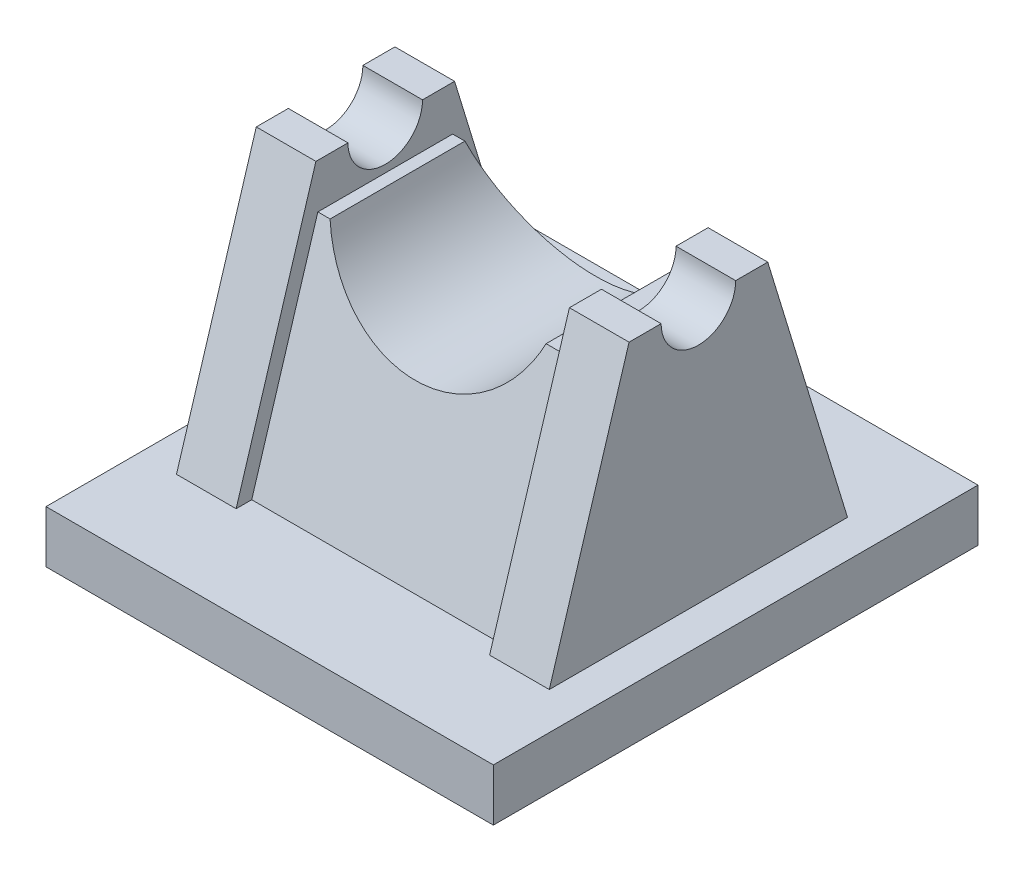
ISO-10303-21;
HEADER;
FILE_DESCRIPTION(('STEP AP214'),'2;1');
FILE_NAME('part.step','',(''),(''),'','','');
FILE_SCHEMA(('AUTOMOTIVE_DESIGN { 1 0 10303 214 1 1 1 1 }'));
ENDSEC;
DATA;
#1=APPLICATION_CONTEXT('core data for automotive mechanical design processes');
#2=APPLICATION_PROTOCOL_DEFINITION('international standard','automotive_design',2000,#1);
#3=PRODUCT_CONTEXT('',#1,'mechanical');
#4=PRODUCT('Part','Part','',(#3));
#5=PRODUCT_RELATED_PRODUCT_CATEGORY('part','',(#4));
#6=PRODUCT_DEFINITION_FORMATION('','',#4);
#7=PRODUCT_DEFINITION_CONTEXT('part definition',#1,'design');
#8=PRODUCT_DEFINITION('design','',#6,#7);
#9=PRODUCT_DEFINITION_SHAPE('','',#8);
#10=(LENGTH_UNIT() NAMED_UNIT(*) SI_UNIT(.MILLI.,.METRE.));
#11=(NAMED_UNIT(*) PLANE_ANGLE_UNIT() SI_UNIT($,.RADIAN.));
#12=(NAMED_UNIT(*) SI_UNIT($,.STERADIAN.) SOLID_ANGLE_UNIT());
#13=UNCERTAINTY_MEASURE_WITH_UNIT(LENGTH_MEASURE(1.E-05),#10,'distance_accuracy_value','');
#14=(GEOMETRIC_REPRESENTATION_CONTEXT(3) GLOBAL_UNCERTAINTY_ASSIGNED_CONTEXT((#13)) GLOBAL_UNIT_ASSIGNED_CONTEXT((#10,
#11,#12)) REPRESENTATION_CONTEXT('',''));
#15=CARTESIAN_POINT('',(0.,0.,0.));
#16=DIRECTION('',(0.,0.,1.));
#17=DIRECTION('',(1.,0.,0.));
#18=AXIS2_PLACEMENT_3D('',#15,#16,#17);
#19=CARTESIAN_POINT('',(-42.,29.,-10.9575732752756));
#20=DIRECTION('',(0.,-1.,0.));
#21=DIRECTION('',(0.,0.,-1.));
#22=AXIS2_PLACEMENT_3D('',#19,#20,#21);
#23=PLANE('',#22);
#24=DIRECTION('',(0.,0.,1.));
#25=VECTOR('',#24,1.);
#26=CARTESIAN_POINT('',(-40.360215297427,29.,-34.));
#27=LINE('',#26,#25);
#28=CARTESIAN_POINT('',(-40.360215297427,29.,-29.0424267247244));
#29=VERTEX_POINT('',#28);
#30=CARTESIAN_POINT('',(-40.360215297427,29.,-10.9575732752756));
#31=VERTEX_POINT('',#30);
#32=EDGE_CURVE('E56',#29,#31,#27,.T.);
#33=ORIENTED_EDGE('',*,*,#32,.F.);
#34=DIRECTION('',(1.,0.,0.));
#35=VECTOR('',#34,1.);
#36=CARTESIAN_POINT('',(-42.,29.,-29.0424267247244));
#37=LINE('',#36,#35);
#38=CARTESIAN_POINT('',(-42.,29.,-29.0424267247244));
#39=VERTEX_POINT('',#38);
#40=EDGE_CURVE('E292',#39,#29,#37,.T.);
#41=ORIENTED_EDGE('',*,*,#40,.F.);
#42=DIRECTION('',(0.,0.,-1.));
#43=VECTOR('',#42,1.);
#44=CARTESIAN_POINT('',(-42.,29.,-10.9575732752756));
#45=LINE('',#44,#43);
#46=CARTESIAN_POINT('',(-42.,29.,-10.9575732752756));
#47=VERTEX_POINT('',#46);
#48=EDGE_CURVE('E257',#47,#39,#45,.T.);
#49=ORIENTED_EDGE('',*,*,#48,.F.);
#50=DIRECTION('',(1.,0.,0.));
#51=VECTOR('',#50,1.);
#52=CARTESIAN_POINT('',(-42.,29.,-10.9575732752756));
#53=LINE('',#52,#51);
#54=EDGE_CURVE('E298',#47,#31,#53,.T.);
#55=ORIENTED_EDGE('',*,*,#54,.T.);
#56=EDGE_LOOP('',(#33,#41,#49,#55));
#57=FACE_BOUND('',#56,.T.);
#58=ADVANCED_FACE('F44',(#57),#23,.F.);
#59=CARTESIAN_POINT('',(-50.,0.,0.));
#60=DIRECTION('',(0.,0.292371704722741,0.956304755963034));
#61=DIRECTION('',(0.,-0.956304755963034,0.292371704722741));
#62=AXIS2_PLACEMENT_3D('',#59,#60,#61);
#63=PLANE('',#62);
#64=DIRECTION('',(1.,0.,0.));
#65=VECTOR('',#64,1.);
#66=CARTESIAN_POINT('',(-50.,35.,-10.7005738510533));
#67=LINE('',#66,#65);
#68=CARTESIAN_POINT('',(-8.,35.,-10.7005738510533));
#69=VERTEX_POINT('',#68);
#70=CARTESIAN_POINT('',(0.,35.,-10.7005738510533));
#71=VERTEX_POINT('',#70);
#72=EDGE_CURVE('E88',#69,#71,#67,.T.);
#73=ORIENTED_EDGE('',*,*,#72,.F.);
#74=DIRECTION('',(0.,-0.956304755963034,0.292371704722741));
#75=VECTOR('',#74,1.);
#76=CARTESIAN_POINT('',(-8.,35.,-10.7005738510533));
#77=LINE('',#76,#75);
#78=CARTESIAN_POINT('',(-8.,0.,0.));
#79=VERTEX_POINT('',#78);
#80=EDGE_CURVE('E243',#69,#79,#77,.T.);
#81=ORIENTED_EDGE('',*,*,#80,.T.);
#82=DIRECTION('',(1.,0.,0.));
#83=VECTOR('',#82,1.);
#84=CARTESIAN_POINT('',(-50.,0.,0.));
#85=LINE('',#84,#83);
#86=CARTESIAN_POINT('',(0.,0.,0.));
#87=VERTEX_POINT('',#86);
#88=EDGE_CURVE('E324',#79,#87,#85,.T.);
#89=ORIENTED_EDGE('',*,*,#88,.T.);
#90=DIRECTION('',(0.,-0.956304755963034,0.292371704722741));
#91=VECTOR('',#90,1.);
#92=CARTESIAN_POINT('',(0.,0.,0.));
#93=LINE('',#92,#91);
#94=EDGE_CURVE('E306',#71,#87,#93,.T.);
#95=ORIENTED_EDGE('',*,*,#94,.F.);
#96=EDGE_LOOP('',(#73,#81,#89,#95));
#97=FACE_BOUND('',#96,.T.);
#98=ADVANCED_FACE('F357',(#97),#63,.T.);
#99=CARTESIAN_POINT('',(-50.,35.,-10.7005738510533));
#100=DIRECTION('',(0.,1.,0.));
#101=DIRECTION('',(0.,0.,1.));
#102=AXIS2_PLACEMENT_3D('',#99,#100,#101);
#103=PLANE('',#102);
#104=DIRECTION('',(0.,0.,-1.));
#105=VECTOR('',#104,1.);
#106=CARTESIAN_POINT('',(-8.,35.,-12.269111485784));
#107=LINE('',#106,#105);
#108=CARTESIAN_POINT('',(-8.,35.,-15.));
#109=VERTEX_POINT('',#108);
#110=EDGE_CURVE('E287',#69,#109,#107,.T.);
#111=ORIENTED_EDGE('',*,*,#110,.F.);
#112=ORIENTED_EDGE('',*,*,#72,.T.);
#113=DIRECTION('',(0.,0.,1.));
#114=VECTOR('',#113,1.);
#115=CARTESIAN_POINT('',(0.,35.,-10.7005738510533));
#116=LINE('',#115,#114);
#117=CARTESIAN_POINT('',(0.,35.,-15.));
#118=VERTEX_POINT('',#117);
#119=EDGE_CURVE('E309',#118,#71,#116,.T.);
#120=ORIENTED_EDGE('',*,*,#119,.F.);
#121=DIRECTION('',(1.,0.,0.));
#122=VECTOR('',#121,1.);
#123=CARTESIAN_POINT('',(-50.,35.,-15.));
#124=LINE('',#123,#122);
#125=EDGE_CURVE('E341',#109,#118,#124,.T.);
#126=ORIENTED_EDGE('',*,*,#125,.F.);
#127=EDGE_LOOP('',(#111,#112,#120,#126));
#128=FACE_BOUND('',#127,.T.);
#129=ADVANCED_FACE('F364',(#128),#103,.T.);
#130=CARTESIAN_POINT('',(-50.,35.,-29.2994261489467));
#131=DIRECTION('',(0.,1.,0.));
#132=DIRECTION('',(0.,0.,1.));
#133=AXIS2_PLACEMENT_3D('',#130,#131,#132);
#134=PLANE('',#133);
#135=CARTESIAN_POINT('',(-8.,35.,-25.));
#136=VERTEX_POINT('',#135);
#137=CARTESIAN_POINT('',(-8.,35.,-29.2994261489467));
#138=VERTEX_POINT('',#137);
#139=EDGE_CURVE('E286',#136,#138,#107,.T.);
#140=ORIENTED_EDGE('',*,*,#139,.F.);
#141=DIRECTION('',(1.,0.,0.));
#142=VECTOR('',#141,1.);
#143=CARTESIAN_POINT('',(-50.,35.,-25.));
#144=LINE('',#143,#142);
#145=CARTESIAN_POINT('',(0.,35.,-25.));
#146=VERTEX_POINT('',#145);
#147=EDGE_CURVE('E349',#136,#146,#144,.T.);
#148=ORIENTED_EDGE('',*,*,#147,.T.);
#149=DIRECTION('',(0.,0.,1.));
#150=VECTOR('',#149,1.);
#151=CARTESIAN_POINT('',(0.,35.,-29.2994261489467));
#152=LINE('',#151,#150);
#153=CARTESIAN_POINT('',(0.,35.,-29.2994261489467));
#154=VERTEX_POINT('',#153);
#155=EDGE_CURVE('E332',#154,#146,#152,.T.);
#156=ORIENTED_EDGE('',*,*,#155,.F.);
#157=DIRECTION('',(1.,0.,0.));
#158=VECTOR('',#157,1.);
#159=CARTESIAN_POINT('',(-50.,35.,-29.2994261489467));
#160=LINE('',#159,#158);
#161=EDGE_CURVE('E348',#138,#154,#160,.T.);
#162=ORIENTED_EDGE('',*,*,#161,.F.);
#163=EDGE_LOOP('',(#140,#148,#156,#162));
#164=FACE_BOUND('',#163,.T.);
#165=ADVANCED_FACE('F374',(#164),#134,.T.);
#166=CARTESIAN_POINT('',(-50.,0.,-40.));
#167=DIRECTION('',(0.,0.292371704722741,-0.956304755963034));
#168=DIRECTION('',(0.,0.956304755963034,0.292371704722741));
#169=AXIS2_PLACEMENT_3D('',#166,#167,#168);
#170=PLANE('',#169);
#171=DIRECTION('',(1.,0.,0.));
#172=VECTOR('',#171,1.);
#173=CARTESIAN_POINT('',(-50.,0.,-40.));
#174=LINE('',#173,#172);
#175=CARTESIAN_POINT('',(-8.,0.,-40.));
#176=VERTEX_POINT('',#175);
#177=CARTESIAN_POINT('',(0.,0.,-40.));
#178=VERTEX_POINT('',#177);
#179=EDGE_CURVE('E352',#176,#178,#174,.T.);
#180=ORIENTED_EDGE('',*,*,#179,.F.);
#181=DIRECTION('',(0.,0.956304755963034,0.292371704722741));
#182=VECTOR('',#181,1.);
#183=CARTESIAN_POINT('',(-8.,0.,-40.));
#184=LINE('',#183,#182);
#185=EDGE_CURVE('E284',#176,#138,#184,.T.);
#186=ORIENTED_EDGE('',*,*,#185,.T.);
#187=ORIENTED_EDGE('',*,*,#161,.T.);
#188=DIRECTION('',(0.,0.956304755963034,0.292371704722741));
#189=VECTOR('',#188,1.);
#190=CARTESIAN_POINT('',(0.,0.,-40.));
#191=LINE('',#190,#189);
#192=EDGE_CURVE('E326',#178,#154,#191,.T.);
#193=ORIENTED_EDGE('',*,*,#192,.F.);
#194=EDGE_LOOP('',(#180,#186,#187,#193));
#195=FACE_BOUND('',#194,.T.);
#196=ADVANCED_FACE('F379',(#195),#170,.T.);
#197=CARTESIAN_POINT('',(-50.,35.,-20.));
#198=DIRECTION('',(1.,0.,0.));
#199=DIRECTION('',(0.,0.,-1.));
#200=AXIS2_PLACEMENT_3D('',#197,#198,#199);
#201=CYLINDRICAL_SURFACE('',#200,5.);
#202=CARTESIAN_POINT('',(-50.,35.,-15.));
#203=VERTEX_POINT('',#202);
#204=CARTESIAN_POINT('',(-42.,34.9999999999999,-15.));
#205=VERTEX_POINT('',#204);
#206=EDGE_CURVE('E342',#203,#205,#124,.T.);
#207=ORIENTED_EDGE('',*,*,#206,.T.);
#208=CARTESIAN_POINT('',(-42.,35.,-20.));
#209=DIRECTION('',(1.,0.,0.));
#210=DIRECTION('',(0.,0.,-1.));
#211=AXIS2_PLACEMENT_3D('',#208,#209,#210);
#212=CIRCLE('',#211,5.);
#213=CARTESIAN_POINT('',(-42.,34.9999999999997,-25.));
#214=VERTEX_POINT('',#213);
#215=EDGE_CURVE('E303',#205,#214,#212,.T.);
#216=ORIENTED_EDGE('',*,*,#215,.T.);
#217=CARTESIAN_POINT('',(-50.,35.,-25.));
#218=VERTEX_POINT('',#217);
#219=EDGE_CURVE('E343',#218,#214,#144,.T.);
#220=ORIENTED_EDGE('',*,*,#219,.F.);
#221=CARTESIAN_POINT('',(-50.,35.,-20.));
#222=DIRECTION('',(-1.,0.,0.));
#223=DIRECTION('',(0.,0.,-1.));
#224=AXIS2_PLACEMENT_3D('',#221,#222,#223);
#225=CIRCLE('',#224,5.);
#226=EDGE_CURVE('E320',#218,#203,#225,.T.);
#227=ORIENTED_EDGE('',*,*,#226,.T.);
#228=EDGE_LOOP('',(#207,#216,#220,#227));
#229=FACE_BOUND('',#228,.T.);
#230=ADVANCED_FACE('F416',(#229),#201,.F.);
#231=DIRECTION('',(0.,-0.956304755963034,0.292371704722741));
#232=VECTOR('',#231,1.);
#233=CARTESIAN_POINT('',(-42.,35.,-10.7005738510533));
#234=LINE('',#233,#232);
#235=CARTESIAN_POINT('',(-42.,35.,-10.7005738510533));
#236=VERTEX_POINT('',#235);
#237=CARTESIAN_POINT('',(-42.,0.,0.));
#238=VERTEX_POINT('',#237);
#239=EDGE_CURVE('E246',#236,#238,#234,.T.);
#240=ORIENTED_EDGE('',*,*,#239,.F.);
#241=CARTESIAN_POINT('',(-50.,35.,-10.7005738510533));
#242=VERTEX_POINT('',#241);
#243=EDGE_CURVE('E52',#242,#236,#67,.T.);
#244=ORIENTED_EDGE('',*,*,#243,.F.);
#245=DIRECTION('',(0.,-0.956304755963034,0.292371704722741));
#246=VECTOR('',#245,1.);
#247=CARTESIAN_POINT('',(-50.,0.,0.));
#248=LINE('',#247,#246);
#249=CARTESIAN_POINT('',(-50.,0.,0.));
#250=VERTEX_POINT('',#249);
#251=EDGE_CURVE('E310',#242,#250,#248,.T.);
#252=ORIENTED_EDGE('',*,*,#251,.T.);
#253=EDGE_CURVE('E354',#250,#238,#85,.T.);
#254=ORIENTED_EDGE('',*,*,#253,.T.);
#255=EDGE_LOOP('',(#240,#244,#252,#254));
#256=FACE_BOUND('',#255,.T.);
#257=ADVANCED_FACE('F50',(#256),#63,.T.);
#258=DIRECTION('',(0.,0.,1.));
#259=VECTOR('',#258,1.);
#260=CARTESIAN_POINT('',(-42.,35.,-12.269111485784));
#261=LINE('',#260,#259);
#262=EDGE_CURVE('E250',#205,#236,#261,.T.);
#263=ORIENTED_EDGE('',*,*,#262,.F.);
#264=ORIENTED_EDGE('',*,*,#206,.F.);
#265=DIRECTION('',(0.,0.,1.));
#266=VECTOR('',#265,1.);
#267=CARTESIAN_POINT('',(-50.,35.,-10.7005738510533));
#268=LINE('',#267,#266);
#269=EDGE_CURVE('E318',#203,#242,#268,.T.);
#270=ORIENTED_EDGE('',*,*,#269,.T.);
#271=ORIENTED_EDGE('',*,*,#243,.T.);
#272=EDGE_LOOP('',(#263,#264,#270,#271));
#273=FACE_BOUND('',#272,.T.);
#274=ADVANCED_FACE('F401',(#273),#103,.T.);
#275=CARTESIAN_POINT('',(-8.,35.,-20.));
#276=DIRECTION('',(1.,0.,0.));
#277=DIRECTION('',(0.,0.,-1.));
#278=AXIS2_PLACEMENT_3D('',#275,#276,#277);
#279=CIRCLE('',#278,5.);
#280=EDGE_CURVE('E293',#109,#136,#279,.T.);
#281=ORIENTED_EDGE('',*,*,#280,.F.);
#282=ORIENTED_EDGE('',*,*,#125,.T.);
#283=CARTESIAN_POINT('',(0.,35.,-20.));
#284=DIRECTION('',(-1.,0.,0.));
#285=DIRECTION('',(0.,0.,-1.));
#286=AXIS2_PLACEMENT_3D('',#283,#284,#285);
#287=CIRCLE('',#286,5.);
#288=EDGE_CURVE('E335',#146,#118,#287,.T.);
#289=ORIENTED_EDGE('',*,*,#288,.F.);
#290=ORIENTED_EDGE('',*,*,#147,.F.);
#291=EDGE_LOOP('',(#281,#282,#289,#290));
#292=FACE_BOUND('',#291,.T.);
#293=ADVANCED_FACE('F370',(#292),#201,.F.);
#294=CARTESIAN_POINT('',(-42.,35.,-29.2994261489467));
#295=VERTEX_POINT('',#294);
#296=EDGE_CURVE('E242',#295,#214,#261,.T.);
#297=ORIENTED_EDGE('',*,*,#296,.F.);
#298=CARTESIAN_POINT('',(-50.,35.,-29.2994261489467));
#299=VERTEX_POINT('',#298);
#300=EDGE_CURVE('E96',#299,#295,#160,.T.);
#301=ORIENTED_EDGE('',*,*,#300,.F.);
#302=DIRECTION('',(0.,0.,1.));
#303=VECTOR('',#302,1.);
#304=CARTESIAN_POINT('',(-50.,35.,-29.2994261489467));
#305=LINE('',#304,#303);
#306=EDGE_CURVE('E314',#299,#218,#305,.T.);
#307=ORIENTED_EDGE('',*,*,#306,.T.);
#308=ORIENTED_EDGE('',*,*,#219,.T.);
#309=EDGE_LOOP('',(#297,#301,#307,#308));
#310=FACE_BOUND('',#309,.T.);
#311=ADVANCED_FACE('F411',(#310),#134,.T.);
#312=DIRECTION('',(0.,0.956304755963034,0.292371704722741));
#313=VECTOR('',#312,1.);
#314=CARTESIAN_POINT('',(-42.,0.,-40.));
#315=LINE('',#314,#313);
#316=CARTESIAN_POINT('',(-42.,0.,-40.));
#317=VERTEX_POINT('',#316);
#318=EDGE_CURVE('E263',#317,#295,#315,.T.);
#319=ORIENTED_EDGE('',*,*,#318,.F.);
#320=CARTESIAN_POINT('',(-50.,0.,-40.));
#321=VERTEX_POINT('',#320);
#322=EDGE_CURVE('E351',#321,#317,#174,.T.);
#323=ORIENTED_EDGE('',*,*,#322,.F.);
#324=DIRECTION('',(0.,0.956304755963034,0.292371704722741));
#325=VECTOR('',#324,1.);
#326=CARTESIAN_POINT('',(-50.,0.,-40.));
#327=LINE('',#326,#325);
#328=EDGE_CURVE('E315',#321,#299,#327,.T.);
#329=ORIENTED_EDGE('',*,*,#328,.T.);
#330=ORIENTED_EDGE('',*,*,#300,.T.);
#331=EDGE_LOOP('',(#319,#323,#329,#330));
#332=FACE_BOUND('',#331,.T.);
#333=ADVANCED_FACE('F414',(#332),#170,.T.);
#334=CARTESIAN_POINT('',(-50.,35.,-20.));
#335=DIRECTION('',(1.,0.,0.));
#336=DIRECTION('',(0.,0.,-1.));
#337=AXIS2_PLACEMENT_3D('',#334,#335,#336);
#338=PLANE('',#337);
#339=ORIENTED_EDGE('',*,*,#251,.F.);
#340=ORIENTED_EDGE('',*,*,#269,.F.);
#341=ORIENTED_EDGE('',*,*,#226,.F.);
#342=ORIENTED_EDGE('',*,*,#306,.F.);
#343=ORIENTED_EDGE('',*,*,#328,.F.);
#344=DIRECTION('',(0.,0.,-1.));
#345=VECTOR('',#344,1.);
#346=CARTESIAN_POINT('',(-50.,0.,-40.));
#347=LINE('',#346,#345);
#348=EDGE_CURVE('E307',#250,#321,#347,.T.);
#349=ORIENTED_EDGE('',*,*,#348,.F.);
#350=EDGE_LOOP('',(#339,#340,#341,#342,#343,#349));
#351=FACE_BOUND('',#350,.T.);
#352=ADVANCED_FACE('F410',(#351),#338,.F.);
#353=CARTESIAN_POINT('',(0.,35.,-20.));
#354=DIRECTION('',(1.,0.,0.));
#355=DIRECTION('',(0.,0.,-1.));
#356=AXIS2_PLACEMENT_3D('',#353,#354,#355);
#357=PLANE('',#356);
#358=ORIENTED_EDGE('',*,*,#94,.T.);
#359=DIRECTION('',(0.,0.,-1.));
#360=VECTOR('',#359,1.);
#361=CARTESIAN_POINT('',(0.,0.,-40.));
#362=LINE('',#361,#360);
#363=EDGE_CURVE('E327',#87,#178,#362,.T.);
#364=ORIENTED_EDGE('',*,*,#363,.T.);
#365=ORIENTED_EDGE('',*,*,#192,.T.);
#366=ORIENTED_EDGE('',*,*,#155,.T.);
#367=ORIENTED_EDGE('',*,*,#288,.T.);
#368=ORIENTED_EDGE('',*,*,#119,.T.);
#369=EDGE_LOOP('',(#358,#364,#365,#366,#367,#368));
#370=FACE_BOUND('',#369,.T.);
#371=ADVANCED_FACE('F363',(#370),#357,.T.);
#372=CARTESIAN_POINT('',(-42.,29.,-29.0424267247244));
#373=DIRECTION('',(0.,-0.292371704722741,0.956304755963034));
#374=DIRECTION('',(0.,-0.956304755963034,-0.292371704722741));
#375=AXIS2_PLACEMENT_3D('',#372,#373,#374);
#376=PLANE('',#375);
#377=ORIENTED_EDGE('',*,*,#40,.T.);
#378=CARTESIAN_POINT('',(-25.8745981630098,34.5151515151515,-27.3562756936494));
#379=DIRECTION('',(0.,-0.292371704722741,0.956304755963034));
#380=DIRECTION('',(0.,0.956304755963034,0.292371704722741));
#381=AXIS2_PLACEMENT_3D('',#378,#379,#380);
#382=ELLIPSE('',#381,16.2082222255508,15.5);
#383=CARTESIAN_POINT('',(-11.3889810285926,29.,-29.0424267247244));
#384=VERTEX_POINT('',#383);
#385=EDGE_CURVE('E237',#29,#384,#382,.T.);
#386=ORIENTED_EDGE('',*,*,#385,.T.);
#387=CARTESIAN_POINT('',(-8.,29.,-29.0424267247244));
#388=VERTEX_POINT('',#387);
#389=EDGE_CURVE('E294',#384,#388,#37,.T.);
#390=ORIENTED_EDGE('',*,*,#389,.T.);
#391=DIRECTION('',(0.,-0.956304755963034,-0.292371704722741));
#392=VECTOR('',#391,1.);
#393=CARTESIAN_POINT('',(-8.,29.,-29.0424267247244));
#394=LINE('',#393,#392);
#395=CARTESIAN_POINT('',(-8.,0.,-37.9086164870257));
#396=VERTEX_POINT('',#395);
#397=EDGE_CURVE('E279',#388,#396,#394,.T.);
#398=ORIENTED_EDGE('',*,*,#397,.T.);
#399=DIRECTION('',(1.,0.,0.));
#400=VECTOR('',#399,1.);
#401=CARTESIAN_POINT('',(-42.,0.,-37.9086164870257));
#402=LINE('',#401,#400);
#403=CARTESIAN_POINT('',(-42.,0.,-37.9086164870257));
#404=VERTEX_POINT('',#403);
#405=EDGE_CURVE('E288',#404,#396,#402,.T.);
#406=ORIENTED_EDGE('',*,*,#405,.F.);
#407=DIRECTION('',(0.,-0.956304755963034,-0.292371704722741));
#408=VECTOR('',#407,1.);
#409=CARTESIAN_POINT('',(-42.,29.,-29.0424267247244));
#410=LINE('',#409,#408);
#411=EDGE_CURVE('E256',#39,#404,#410,.T.);
#412=ORIENTED_EDGE('',*,*,#411,.F.);
#413=EDGE_LOOP('',(#377,#386,#390,#398,#406,#412));
#414=FACE_BOUND('',#413,.T.);
#415=ADVANCED_FACE('F387',(#414),#376,.F.);
#416=ORIENTED_EDGE('',*,*,#389,.F.);
#417=DIRECTION('',(0.,0.,1.));
#418=VECTOR('',#417,1.);
#419=CARTESIAN_POINT('',(-11.3889810285926,29.,-34.));
#420=LINE('',#419,#418);
#421=CARTESIAN_POINT('',(-11.3889810285926,29.,-10.9575732752756));
#422=VERTEX_POINT('',#421);
#423=EDGE_CURVE('E233',#384,#422,#420,.T.);
#424=ORIENTED_EDGE('',*,*,#423,.T.);
#425=CARTESIAN_POINT('',(-8.,29.,-10.9575732752756));
#426=VERTEX_POINT('',#425);
#427=EDGE_CURVE('E299',#422,#426,#53,.T.);
#428=ORIENTED_EDGE('',*,*,#427,.T.);
#429=DIRECTION('',(0.,0.,-1.));
#430=VECTOR('',#429,1.);
#431=CARTESIAN_POINT('',(-8.,29.,-10.9575732752756));
#432=LINE('',#431,#430);
#433=EDGE_CURVE('E273',#426,#388,#432,.T.);
#434=ORIENTED_EDGE('',*,*,#433,.T.);
#435=EDGE_LOOP('',(#416,#424,#428,#434));
#436=FACE_BOUND('',#435,.T.);
#437=ADVANCED_FACE('F388',(#436),#23,.F.);
#438=CARTESIAN_POINT('',(-42.,29.,-10.9575732752756));
#439=DIRECTION('',(0.,0.292371704722741,0.956304755963034));
#440=DIRECTION('',(0.,-0.956304755963034,0.292371704722741));
#441=AXIS2_PLACEMENT_3D('',#438,#439,#440);
#442=PLANE('',#441);
#443=CARTESIAN_POINT('',(-25.8745981630098,34.5151515151515,-12.6437243063506));
#444=DIRECTION('',(0.,0.292371704722741,0.956304755963034));
#445=DIRECTION('',(0.,-0.956304755963034,0.292371704722741));
#446=AXIS2_PLACEMENT_3D('',#443,#444,#445);
#447=ELLIPSE('',#446,16.2082222255508,15.5);
#448=EDGE_CURVE('E11',#31,#422,#447,.T.);
#449=ORIENTED_EDGE('',*,*,#448,.F.);
#450=ORIENTED_EDGE('',*,*,#54,.F.);
#451=DIRECTION('',(0.,-0.956304755963034,0.292371704722741));
#452=VECTOR('',#451,1.);
#453=CARTESIAN_POINT('',(-42.,29.,-10.9575732752756));
#454=LINE('',#453,#452);
#455=CARTESIAN_POINT('',(-42.,0.,-2.0913835129743));
#456=VERTEX_POINT('',#455);
#457=EDGE_CURVE('E254',#47,#456,#454,.T.);
#458=ORIENTED_EDGE('',*,*,#457,.T.);
#459=DIRECTION('',(1.,0.,0.));
#460=VECTOR('',#459,1.);
#461=CARTESIAN_POINT('',(-42.,0.,-2.0913835129743));
#462=LINE('',#461,#460);
#463=CARTESIAN_POINT('',(-8.,0.,-2.0913835129743));
#464=VERTEX_POINT('',#463);
#465=EDGE_CURVE('E267',#456,#464,#462,.T.);
#466=ORIENTED_EDGE('',*,*,#465,.T.);
#467=DIRECTION('',(0.,-0.956304755963034,0.292371704722741));
#468=VECTOR('',#467,1.);
#469=CARTESIAN_POINT('',(-8.,29.,-10.9575732752756));
#470=LINE('',#469,#468);
#471=EDGE_CURVE('E275',#426,#464,#470,.T.);
#472=ORIENTED_EDGE('',*,*,#471,.F.);
#473=ORIENTED_EDGE('',*,*,#427,.F.);
#474=EDGE_LOOP('',(#449,#450,#458,#466,#472,#473));
#475=FACE_BOUND('',#474,.T.);
#476=ADVANCED_FACE('F391',(#475),#442,.T.);
#477=CARTESIAN_POINT('',(-42.,0.,0.));
#478=DIRECTION('',(1.,0.,0.));
#479=DIRECTION('',(0.,0.,-1.));
#480=AXIS2_PLACEMENT_3D('',#477,#478,#479);
#481=PLANE('',#480);
#482=ORIENTED_EDGE('',*,*,#262,.T.);
#483=ORIENTED_EDGE('',*,*,#239,.T.);
#484=DIRECTION('',(0.,0.,-1.));
#485=VECTOR('',#484,1.);
#486=CARTESIAN_POINT('',(-42.,0.,0.));
#487=LINE('',#486,#485);
#488=EDGE_CURVE('E249',#238,#456,#487,.T.);
#489=ORIENTED_EDGE('',*,*,#488,.T.);
#490=ORIENTED_EDGE('',*,*,#457,.F.);
#491=ORIENTED_EDGE('',*,*,#48,.T.);
#492=ORIENTED_EDGE('',*,*,#411,.T.);
#493=DIRECTION('',(0.,0.,-1.));
#494=VECTOR('',#493,1.);
#495=CARTESIAN_POINT('',(-42.,0.,-37.9086164870257));
#496=LINE('',#495,#494);
#497=EDGE_CURVE('E265',#404,#317,#496,.T.);
#498=ORIENTED_EDGE('',*,*,#497,.T.);
#499=ORIENTED_EDGE('',*,*,#318,.T.);
#500=ORIENTED_EDGE('',*,*,#296,.T.);
#501=ORIENTED_EDGE('',*,*,#215,.F.);
#502=EDGE_LOOP('',(#482,#483,#489,#490,#491,#492,#498,#499,#500,#501));
#503=FACE_BOUND('',#502,.T.);
#504=ADVANCED_FACE('F398',(#503),#481,.T.);
#505=CARTESIAN_POINT('',(-8.,0.,0.));
#506=DIRECTION('',(1.,0.,0.));
#507=DIRECTION('',(0.,0.,-1.));
#508=AXIS2_PLACEMENT_3D('',#505,#506,#507);
#509=PLANE('',#508);
#510=ORIENTED_EDGE('',*,*,#280,.T.);
#511=ORIENTED_EDGE('',*,*,#139,.T.);
#512=ORIENTED_EDGE('',*,*,#185,.F.);
#513=DIRECTION('',(0.,0.,-1.));
#514=VECTOR('',#513,1.);
#515=CARTESIAN_POINT('',(-8.,0.,-37.9086164870257));
#516=LINE('',#515,#514);
#517=EDGE_CURVE('E282',#396,#176,#516,.T.);
#518=ORIENTED_EDGE('',*,*,#517,.F.);
#519=ORIENTED_EDGE('',*,*,#397,.F.);
#520=ORIENTED_EDGE('',*,*,#433,.F.);
#521=ORIENTED_EDGE('',*,*,#471,.T.);
#522=DIRECTION('',(0.,0.,-1.));
#523=VECTOR('',#522,1.);
#524=CARTESIAN_POINT('',(-8.,0.,0.));
#525=LINE('',#524,#523);
#526=EDGE_CURVE('E270',#79,#464,#525,.T.);
#527=ORIENTED_EDGE('',*,*,#526,.F.);
#528=ORIENTED_EDGE('',*,*,#80,.F.);
#529=ORIENTED_EDGE('',*,*,#110,.T.);
#530=EDGE_LOOP('',(#510,#511,#512,#518,#519,#520,#521,#527,#528,#529));
#531=FACE_BOUND('',#530,.T.);
#532=ADVANCED_FACE('F371',(#531),#509,.F.);
#533=CARTESIAN_POINT('',(-25.8745981630098,34.5151515151515,-34.));
#534=DIRECTION('',(0.,0.,1.));
#535=DIRECTION('',(1.,0.,0.));
#536=AXIS2_PLACEMENT_3D('',#533,#534,#535);
#537=CYLINDRICAL_SURFACE('',#536,15.5);
#538=ORIENTED_EDGE('',*,*,#32,.T.);
#539=ORIENTED_EDGE('',*,*,#448,.T.);
#540=ORIENTED_EDGE('',*,*,#423,.F.);
#541=ORIENTED_EDGE('',*,*,#385,.F.);
#542=EDGE_LOOP('',(#538,#539,#540,#541));
#543=FACE_BOUND('',#542,.T.);
#544=ADVANCED_FACE('F448',(#543),#537,.F.);
#545=CARTESIAN_POINT('',(5.,-7.,-52.5));
#546=DIRECTION('',(-1.,0.,0.));
#547=DIRECTION('',(0.,0.,1.));
#548=AXIS2_PLACEMENT_3D('',#545,#546,#547);
#549=PLANE('',#548);
#550=DIRECTION('',(0.,0.,1.));
#551=VECTOR('',#550,1.);
#552=CARTESIAN_POINT('',(5.,0.,-52.5));
#553=LINE('',#552,#551);
#554=CARTESIAN_POINT('',(5.,0.,-52.5));
#555=VERTEX_POINT('',#554);
#556=CARTESIAN_POINT('',(5.,0.,12.5));
#557=VERTEX_POINT('',#556);
#558=EDGE_CURVE('E229',#555,#557,#553,.T.);
#559=ORIENTED_EDGE('',*,*,#558,.T.);
#560=DIRECTION('',(0.,1.,0.));
#561=VECTOR('',#560,1.);
#562=CARTESIAN_POINT('',(5.,-7.,12.5));
#563=LINE('',#562,#561);
#564=CARTESIAN_POINT('',(5.,-7.,12.5));
#565=VERTEX_POINT('',#564);
#566=EDGE_CURVE('E208',#565,#557,#563,.T.);
#567=ORIENTED_EDGE('',*,*,#566,.F.);
#568=DIRECTION('',(0.,0.,1.));
#569=VECTOR('',#568,1.);
#570=CARTESIAN_POINT('',(5.,-7.,-52.5));
#571=LINE('',#570,#569);
#572=CARTESIAN_POINT('',(5.,-7.,-52.5));
#573=VERTEX_POINT('',#572);
#574=EDGE_CURVE('E220',#573,#565,#571,.T.);
#575=ORIENTED_EDGE('',*,*,#574,.F.);
#576=DIRECTION('',(0.,1.,0.));
#577=VECTOR('',#576,1.);
#578=CARTESIAN_POINT('',(5.,-7.,-52.5));
#579=LINE('',#578,#577);
#580=EDGE_CURVE('E642',#573,#555,#579,.T.);
#581=ORIENTED_EDGE('',*,*,#580,.T.);
#582=EDGE_LOOP('',(#559,#567,#575,#581));
#583=FACE_BOUND('',#582,.T.);
#584=ADVANCED_FACE('F226',(#583),#549,.F.);
#585=CARTESIAN_POINT('',(-55.,-7.,12.5));
#586=DIRECTION('',(0.,0.,-1.));
#587=DIRECTION('',(0.,1.,0.));
#588=AXIS2_PLACEMENT_3D('',#585,#586,#587);
#589=PLANE('',#588);
#590=DIRECTION('',(-1.,0.,0.));
#591=VECTOR('',#590,1.);
#592=CARTESIAN_POINT('',(-55.,0.,12.5));
#593=LINE('',#592,#591);
#594=CARTESIAN_POINT('',(-55.,0.,12.5));
#595=VERTEX_POINT('',#594);
#596=EDGE_CURVE('E650',#557,#595,#593,.T.);
#597=ORIENTED_EDGE('',*,*,#596,.T.);
#598=DIRECTION('',(0.,1.,0.));
#599=VECTOR('',#598,1.);
#600=CARTESIAN_POINT('',(-55.,-7.,12.5));
#601=LINE('',#600,#599);
#602=CARTESIAN_POINT('',(-55.,-7.,12.5));
#603=VERTEX_POINT('',#602);
#604=EDGE_CURVE('E214',#603,#595,#601,.T.);
#605=ORIENTED_EDGE('',*,*,#604,.F.);
#606=DIRECTION('',(-1.,0.,0.));
#607=VECTOR('',#606,1.);
#608=CARTESIAN_POINT('',(-55.,-7.,12.5));
#609=LINE('',#608,#607);
#610=EDGE_CURVE('E207',#565,#603,#609,.T.);
#611=ORIENTED_EDGE('',*,*,#610,.F.);
#612=ORIENTED_EDGE('',*,*,#566,.T.);
#613=EDGE_LOOP('',(#597,#605,#611,#612));
#614=FACE_BOUND('',#613,.T.);
#615=ADVANCED_FACE('F206',(#614),#589,.F.);
#616=CARTESIAN_POINT('',(-55.,-7.,-52.5));
#617=DIRECTION('',(1.,0.,0.));
#618=DIRECTION('',(0.,0.,-1.));
#619=AXIS2_PLACEMENT_3D('',#616,#617,#618);
#620=PLANE('',#619);
#621=DIRECTION('',(0.,0.,-1.));
#622=VECTOR('',#621,1.);
#623=CARTESIAN_POINT('',(-55.,0.,-52.5));
#624=LINE('',#623,#622);
#625=CARTESIAN_POINT('',(-55.,0.,-52.5));
#626=VERTEX_POINT('',#625);
#627=EDGE_CURVE('E641',#595,#626,#624,.T.);
#628=ORIENTED_EDGE('',*,*,#627,.T.);
#629=DIRECTION('',(0.,1.,0.));
#630=VECTOR('',#629,1.);
#631=CARTESIAN_POINT('',(-55.,-7.,-52.5));
#632=LINE('',#631,#630);
#633=CARTESIAN_POINT('',(-55.,-7.,-52.5));
#634=VERTEX_POINT('',#633);
#635=EDGE_CURVE('E232',#634,#626,#632,.T.);
#636=ORIENTED_EDGE('',*,*,#635,.F.);
#637=DIRECTION('',(0.,0.,-1.));
#638=VECTOR('',#637,1.);
#639=CARTESIAN_POINT('',(-55.,-7.,-52.5));
#640=LINE('',#639,#638);
#641=EDGE_CURVE('E217',#603,#634,#640,.T.);
#642=ORIENTED_EDGE('',*,*,#641,.F.);
#643=ORIENTED_EDGE('',*,*,#604,.T.);
#644=EDGE_LOOP('',(#628,#636,#642,#643));
#645=FACE_BOUND('',#644,.T.);
#646=ADVANCED_FACE('F459',(#645),#620,.F.);
#647=CARTESIAN_POINT('',(-55.,-7.,-52.5));
#648=DIRECTION('',(0.,0.,1.));
#649=DIRECTION('',(0.,-1.,0.));
#650=AXIS2_PLACEMENT_3D('',#647,#648,#649);
#651=PLANE('',#650);
#652=DIRECTION('',(1.,0.,0.));
#653=VECTOR('',#652,1.);
#654=CARTESIAN_POINT('',(-55.,0.,-52.5));
#655=LINE('',#654,#653);
#656=EDGE_CURVE('E228',#626,#555,#655,.T.);
#657=ORIENTED_EDGE('',*,*,#656,.T.);
#658=ORIENTED_EDGE('',*,*,#580,.F.);
#659=DIRECTION('',(1.,0.,0.));
#660=VECTOR('',#659,1.);
#661=CARTESIAN_POINT('',(-55.,-7.,-52.5));
#662=LINE('',#661,#660);
#663=EDGE_CURVE('E222',#634,#573,#662,.T.);
#664=ORIENTED_EDGE('',*,*,#663,.F.);
#665=ORIENTED_EDGE('',*,*,#635,.T.);
#666=EDGE_LOOP('',(#657,#658,#664,#665));
#667=FACE_BOUND('',#666,.T.);
#668=ADVANCED_FACE('F461',(#667),#651,.F.);
#669=CARTESIAN_POINT('',(0.,-7.,0.));
#670=DIRECTION('',(0.,1.,0.));
#671=DIRECTION('',(0.,0.,1.));
#672=AXIS2_PLACEMENT_3D('',#669,#670,#671);
#673=PLANE('',#672);
#674=ORIENTED_EDGE('',*,*,#574,.T.);
#675=ORIENTED_EDGE('',*,*,#610,.T.);
#676=ORIENTED_EDGE('',*,*,#641,.T.);
#677=ORIENTED_EDGE('',*,*,#663,.T.);
#678=EDGE_LOOP('',(#674,#675,#676,#677));
#679=FACE_BOUND('',#678,.T.);
#680=ADVANCED_FACE('F218',(#679),#673,.F.);
#681=CARTESIAN_POINT('',(0.,0.,0.));
#682=DIRECTION('',(0.,1.,0.));
#683=DIRECTION('',(0.,0.,1.));
#684=AXIS2_PLACEMENT_3D('',#681,#682,#683);
#685=PLANE('',#684);
#686=ORIENTED_EDGE('',*,*,#497,.F.);
#687=ORIENTED_EDGE('',*,*,#405,.T.);
#688=ORIENTED_EDGE('',*,*,#517,.T.);
#689=ORIENTED_EDGE('',*,*,#179,.T.);
#690=ORIENTED_EDGE('',*,*,#363,.F.);
#691=ORIENTED_EDGE('',*,*,#88,.F.);
#692=ORIENTED_EDGE('',*,*,#526,.T.);
#693=ORIENTED_EDGE('',*,*,#465,.F.);
#694=ORIENTED_EDGE('',*,*,#488,.F.);
#695=ORIENTED_EDGE('',*,*,#253,.F.);
#696=ORIENTED_EDGE('',*,*,#348,.T.);
#697=ORIENTED_EDGE('',*,*,#322,.T.);
#698=EDGE_LOOP('',(#686,#687,#688,#689,#690,#691,#692,#693,#694,#695,#696,#697));
#699=FACE_BOUND('',#698,.T.);
#700=ORIENTED_EDGE('',*,*,#558,.F.);
#701=ORIENTED_EDGE('',*,*,#656,.F.);
#702=ORIENTED_EDGE('',*,*,#627,.F.);
#703=ORIENTED_EDGE('',*,*,#596,.F.);
#704=EDGE_LOOP('',(#700,#701,#702,#703));
#705=FACE_BOUND('',#704,.T.);
#706=ADVANCED_FACE('F396',(#699,#705),#685,.T.);
#707=CLOSED_SHELL('',(#58,#98,#129,#165,#196,#230,#257,#274,#293,#311,#333,#352,#371,#415,#437,
#476,#504,#532,#544,#584,#615,#646,#668,#680,#706));
#708=MANIFOLD_SOLID_BREP('B2',#707);
#709=ADVANCED_BREP_SHAPE_REPRESENTATION('',(#18,#708),#14);
#710=SHAPE_DEFINITION_REPRESENTATION(#9,#709);
ENDSEC;
END-ISO-10303-21;
